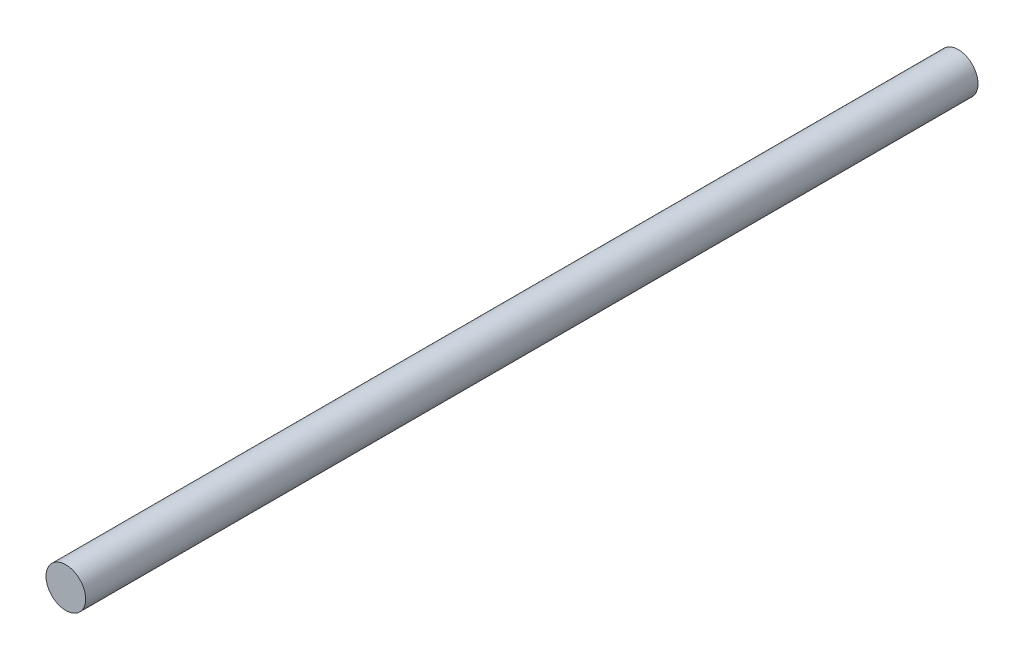
ISO-10303-21;
HEADER;
FILE_DESCRIPTION(('STEP AP214'),'2;1');
FILE_NAME('part.step','',(''),(''),'','','');
FILE_SCHEMA(('AUTOMOTIVE_DESIGN { 1 0 10303 214 1 1 1 1 }'));
ENDSEC;
DATA;
#1=APPLICATION_CONTEXT('core data for automotive mechanical design processes');
#2=APPLICATION_PROTOCOL_DEFINITION('international standard','automotive_design',2000,#1);
#3=PRODUCT_CONTEXT('',#1,'mechanical');
#4=PRODUCT('Part','Part','',(#3));
#5=PRODUCT_RELATED_PRODUCT_CATEGORY('part','',(#4));
#6=PRODUCT_DEFINITION_FORMATION('','',#4);
#7=PRODUCT_DEFINITION_CONTEXT('part definition',#1,'design');
#8=PRODUCT_DEFINITION('design','',#6,#7);
#9=PRODUCT_DEFINITION_SHAPE('','',#8);
#10=(LENGTH_UNIT() NAMED_UNIT(*) SI_UNIT(.MILLI.,.METRE.));
#11=(NAMED_UNIT(*) PLANE_ANGLE_UNIT() SI_UNIT($,.RADIAN.));
#12=(NAMED_UNIT(*) SI_UNIT($,.STERADIAN.) SOLID_ANGLE_UNIT());
#13=UNCERTAINTY_MEASURE_WITH_UNIT(LENGTH_MEASURE(1.E-05),#10,'distance_accuracy_value','');
#14=(GEOMETRIC_REPRESENTATION_CONTEXT(3) GLOBAL_UNCERTAINTY_ASSIGNED_CONTEXT((#13)) GLOBAL_UNIT_ASSIGNED_CONTEXT((#10,
#11,#12)) REPRESENTATION_CONTEXT('',''));
#15=CARTESIAN_POINT('',(0.,0.,0.));
#16=DIRECTION('',(0.,0.,1.));
#17=DIRECTION('',(1.,0.,0.));
#18=AXIS2_PLACEMENT_3D('',#15,#16,#17);
#19=CARTESIAN_POINT('',(0.,0.,90.));
#20=DIRECTION('',(0.,0.,-1.));
#21=DIRECTION('',(-1.,0.,0.));
#22=AXIS2_PLACEMENT_3D('',#19,#20,#21);
#23=CYLINDRICAL_SURFACE('',#22,4.);
#24=CARTESIAN_POINT('',(0.,0.,90.));
#25=DIRECTION('',(0.,0.,1.));
#26=DIRECTION('',(1.,0.,0.));
#27=AXIS2_PLACEMENT_3D('',#24,#25,#26);
#28=CIRCLE('',#27,4.);
#29=CARTESIAN_POINT('',(-4.,0.,90.));
#30=VERTEX_POINT('',#29);
#31=EDGE_CURVE('E10',#30,#30,#28,.T.);
#32=CARTESIAN_POINT('',(0.,0.,-90.));
#33=DIRECTION('',(0.,0.,1.));
#34=DIRECTION('',(1.,0.,0.));
#35=AXIS2_PLACEMENT_3D('',#32,#33,#34);
#36=CIRCLE('',#35,4.);
#37=CARTESIAN_POINT('',(-4.,0.,-90.));
#38=VERTEX_POINT('',#37);
#39=EDGE_CURVE('E36',#38,#38,#36,.T.);
#40=CARTESIAN_POINT('',(-4.,0.,90.));
#41=CARTESIAN_POINT('',(-4.,0.,88.125));
#42=CARTESIAN_POINT('',(-4.,0.,86.25));
#43=CARTESIAN_POINT('',(-4.,0.,82.5));
#44=CARTESIAN_POINT('',(-4.,0.,80.625));
#45=CARTESIAN_POINT('',(-4.,0.,76.875));
#46=CARTESIAN_POINT('',(-4.,0.,75.));
#47=CARTESIAN_POINT('',(-4.,0.,71.25));
#48=CARTESIAN_POINT('',(-4.,0.,69.375));
#49=CARTESIAN_POINT('',(-4.,0.,65.625));
#50=CARTESIAN_POINT('',(-4.,0.,63.75));
#51=CARTESIAN_POINT('',(-4.,0.,60.));
#52=CARTESIAN_POINT('',(-4.,0.,58.125));
#53=CARTESIAN_POINT('',(-4.,0.,54.375));
#54=CARTESIAN_POINT('',(-4.,0.,52.5));
#55=CARTESIAN_POINT('',(-4.,0.,48.75));
#56=CARTESIAN_POINT('',(-4.,0.,46.875));
#57=CARTESIAN_POINT('',(-4.,0.,43.125));
#58=CARTESIAN_POINT('',(-4.,0.,41.25));
#59=CARTESIAN_POINT('',(-4.,0.,37.5));
#60=CARTESIAN_POINT('',(-4.,0.,35.625));
#61=CARTESIAN_POINT('',(-4.,0.,31.875));
#62=CARTESIAN_POINT('',(-4.,0.,30.));
#63=CARTESIAN_POINT('',(-4.,0.,26.25));
#64=CARTESIAN_POINT('',(-4.,0.,24.375));
#65=CARTESIAN_POINT('',(-4.,0.,20.625));
#66=CARTESIAN_POINT('',(-4.,0.,18.75));
#67=CARTESIAN_POINT('',(-4.,0.,15.));
#68=CARTESIAN_POINT('',(-4.,0.,13.125));
#69=CARTESIAN_POINT('',(-4.,0.,9.37499999999998));
#70=CARTESIAN_POINT('',(-4.,0.,7.49999999999998));
#71=CARTESIAN_POINT('',(-4.,0.,3.74999999999998));
#72=CARTESIAN_POINT('',(-4.,0.,1.87499999999997));
#73=CARTESIAN_POINT('',(-4.,0.,-1.87500000000003));
#74=CARTESIAN_POINT('',(-4.,0.,-3.75000000000003));
#75=CARTESIAN_POINT('',(-4.,0.,-7.50000000000003));
#76=CARTESIAN_POINT('',(-4.,0.,-9.37500000000004));
#77=CARTESIAN_POINT('',(-4.,0.,-13.125));
#78=CARTESIAN_POINT('',(-4.,0.,-15.));
#79=CARTESIAN_POINT('',(-4.,0.,-18.75));
#80=CARTESIAN_POINT('',(-4.,0.,-20.625));
#81=CARTESIAN_POINT('',(-4.,0.,-24.375));
#82=CARTESIAN_POINT('',(-4.,0.,-26.25));
#83=CARTESIAN_POINT('',(-4.,0.,-30.));
#84=CARTESIAN_POINT('',(-4.,0.,-31.875));
#85=CARTESIAN_POINT('',(-4.,0.,-35.625));
#86=CARTESIAN_POINT('',(-4.,0.,-37.5));
#87=CARTESIAN_POINT('',(-4.,0.,-41.25));
#88=CARTESIAN_POINT('',(-4.,0.,-43.125));
#89=CARTESIAN_POINT('',(-4.,0.,-46.875));
#90=CARTESIAN_POINT('',(-4.,0.,-48.75));
#91=CARTESIAN_POINT('',(-4.,0.,-52.5));
#92=CARTESIAN_POINT('',(-4.,0.,-54.375));
#93=CARTESIAN_POINT('',(-4.,0.,-58.125));
#94=CARTESIAN_POINT('',(-4.,0.,-60.));
#95=CARTESIAN_POINT('',(-4.,0.,-63.75));
#96=CARTESIAN_POINT('',(-4.,0.,-65.625));
#97=CARTESIAN_POINT('',(-4.,0.,-69.375));
#98=CARTESIAN_POINT('',(-4.,0.,-71.25));
#99=CARTESIAN_POINT('',(-4.,0.,-75.));
#100=CARTESIAN_POINT('',(-4.,0.,-76.875));
#101=CARTESIAN_POINT('',(-4.,0.,-80.625));
#102=CARTESIAN_POINT('',(-4.,0.,-82.5));
#103=CARTESIAN_POINT('',(-4.,0.,-86.25));
#104=CARTESIAN_POINT('',(-4.,0.,-88.125));
#105=CARTESIAN_POINT('',(-4.,0.,-90.));
#106=B_SPLINE_CURVE_WITH_KNOTS('',3,(#40,#41,#42,#43,#44,#45,#46,#47,#48,#49,#50,#51,#52,#53,
#54,#55,#56,#57,#58,#59,#60,#61,#62,#63,#64,#65,#66,#67,#68,#69,#70,#71,#72,#73,#74,#75,#76,#77,
#78,#79,#80,#81,#82,#83,#84,#85,#86,#87,#88,#89,#90,#91,#92,#93,#94,#95,#96,#97,#98,#99,#100,
#101,#102,#103,#104,#105),.UNSPECIFIED.,.F.,.F.,(4,2,2,2,2,2,2,2,2,2,2,2,2,2,2,2,2,2,2,2,2,2,2,
2,2,2,2,2,2,2,2,2,4),(0.,5.62499999999999,11.25,16.875,22.5,28.125,33.75,39.375,45.,50.625,
56.25,61.875,67.5,73.125,78.75,84.375,90.,95.625,101.25,106.875,112.5,118.125,123.75,129.375,
135.,140.625,146.25,151.875,157.5,163.125,168.75,174.375,180.),.UNSPECIFIED.);
#107=EDGE_CURVE('BSEAM33',#30,#38,#106,.T.);
#108=ORIENTED_EDGE('',*,*,#31,.F.);
#109=ORIENTED_EDGE('',*,*,#39,.T.);
#110=ORIENTED_EDGE('',*,*,#107,.T.);
#111=ORIENTED_EDGE('',*,*,#107,.F.);
#112=EDGE_LOOP('',(#108,#110,#109,#111));
#113=FACE_BOUND('',#112,.T.);
#114=ADVANCED_FACE('F33',(#113),#23,.T.);
#115=CARTESIAN_POINT('',(0.,0.,90.));
#116=DIRECTION('',(0.,0.,1.));
#117=DIRECTION('',(1.,0.,0.));
#118=AXIS2_PLACEMENT_3D('',#115,#116,#117);
#119=PLANE('',#118);
#120=ORIENTED_EDGE('',*,*,#31,.T.);
#121=EDGE_LOOP('',(#120));
#122=FACE_BOUND('',#121,.T.);
#123=ADVANCED_FACE('F48',(#122),#119,.T.);
#124=CARTESIAN_POINT('',(0.,0.,-90.));
#125=DIRECTION('',(0.,0.,1.));
#126=DIRECTION('',(1.,0.,0.));
#127=AXIS2_PLACEMENT_3D('',#124,#125,#126);
#128=PLANE('',#127);
#129=ORIENTED_EDGE('',*,*,#39,.F.);
#130=EDGE_LOOP('',(#129));
#131=FACE_BOUND('',#130,.T.);
#132=ADVANCED_FACE('F46',(#131),#128,.F.);
#133=CLOSED_SHELL('',(#114,#123,#132));
#134=MANIFOLD_SOLID_BREP('B2',#133);
#135=ADVANCED_BREP_SHAPE_REPRESENTATION('',(#18,#134),#14);
#136=SHAPE_DEFINITION_REPRESENTATION(#9,#135);
ENDSEC;
END-ISO-10303-21;
